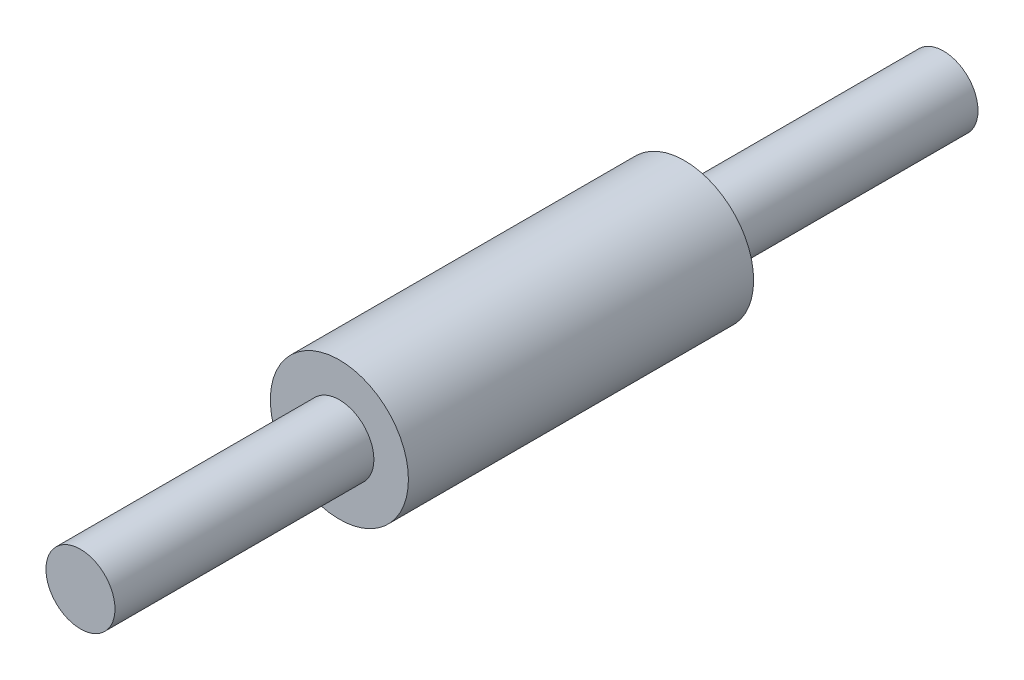
ISO-10303-21;
HEADER;
FILE_DESCRIPTION(('STEP AP214'),'2;1');
FILE_NAME('part.step','',(''),(''),'','','');
FILE_SCHEMA(('AUTOMOTIVE_DESIGN { 1 0 10303 214 1 1 1 1 }'));
ENDSEC;
DATA;
#1=APPLICATION_CONTEXT('core data for automotive mechanical design processes');
#2=APPLICATION_PROTOCOL_DEFINITION('international standard','automotive_design',2000,#1);
#3=PRODUCT_CONTEXT('',#1,'mechanical');
#4=PRODUCT('Part','Part','',(#3));
#5=PRODUCT_RELATED_PRODUCT_CATEGORY('part','',(#4));
#6=PRODUCT_DEFINITION_FORMATION('','',#4);
#7=PRODUCT_DEFINITION_CONTEXT('part definition',#1,'design');
#8=PRODUCT_DEFINITION('design','',#6,#7);
#9=PRODUCT_DEFINITION_SHAPE('','',#8);
#10=(LENGTH_UNIT() NAMED_UNIT(*) SI_UNIT(.MILLI.,.METRE.));
#11=(NAMED_UNIT(*) PLANE_ANGLE_UNIT() SI_UNIT($,.RADIAN.));
#12=(NAMED_UNIT(*) SI_UNIT($,.STERADIAN.) SOLID_ANGLE_UNIT());
#13=UNCERTAINTY_MEASURE_WITH_UNIT(LENGTH_MEASURE(1.E-05),#10,'distance_accuracy_value','');
#14=(GEOMETRIC_REPRESENTATION_CONTEXT(3) GLOBAL_UNCERTAINTY_ASSIGNED_CONTEXT((#13)) GLOBAL_UNIT_ASSIGNED_CONTEXT((#10,
#11,#12)) REPRESENTATION_CONTEXT('',''));
#15=CARTESIAN_POINT('',(0.,0.,0.));
#16=DIRECTION('',(0.,0.,1.));
#17=DIRECTION('',(1.,0.,0.));
#18=AXIS2_PLACEMENT_3D('',#15,#16,#17);
#19=CARTESIAN_POINT('',(0.,0.,-125.));
#20=DIRECTION('',(0.,0.,1.));
#21=DIRECTION('',(1.,0.,0.));
#22=AXIS2_PLACEMENT_3D('',#19,#20,#21);
#23=PLANE('',#22);
#24=CARTESIAN_POINT('',(0.,0.,-125.));
#25=DIRECTION('',(0.,0.,1.));
#26=DIRECTION('',(1.,0.,0.));
#27=AXIS2_PLACEMENT_3D('',#24,#25,#26);
#28=CIRCLE('',#27,10.);
#29=CARTESIAN_POINT('',(10.,0.,-125.));
#30=VERTEX_POINT('',#29);
#31=EDGE_CURVE('E10',#30,#30,#28,.T.);
#32=ORIENTED_EDGE('',*,*,#31,.F.);
#33=EDGE_LOOP('',(#32));
#34=FACE_BOUND('',#33,.T.);
#35=ADVANCED_FACE('F37',(#34),#23,.F.);
#36=CARTESIAN_POINT('',(0.,0.,125.));
#37=DIRECTION('',(0.,0.,1.));
#38=DIRECTION('',(1.,0.,0.));
#39=AXIS2_PLACEMENT_3D('',#36,#37,#38);
#40=CYLINDRICAL_SURFACE('',#39,9.99999999999999);
#41=CARTESIAN_POINT('',(0.,0.,-50.));
#42=DIRECTION('',(0.,0.,1.));
#43=DIRECTION('',(1.,0.,0.));
#44=AXIS2_PLACEMENT_3D('',#41,#42,#43);
#45=CIRCLE('',#44,9.99999999999999);
#46=CARTESIAN_POINT('',(9.99999999999999,0.,-50.));
#47=VERTEX_POINT('',#46);
#48=EDGE_CURVE('E44',#47,#47,#45,.T.);
#49=ORIENTED_EDGE('',*,*,#48,.F.);
#50=EDGE_LOOP('',(#49));
#51=FACE_BOUND('',#50,.T.);
#52=ORIENTED_EDGE('',*,*,#31,.T.);
#53=EDGE_LOOP('',(#52));
#54=FACE_BOUND('',#53,.T.);
#55=ADVANCED_FACE('F91',(#51,#54),#40,.T.);
#56=CARTESIAN_POINT('',(-9.99999999999999,0.,-50.));
#57=DIRECTION('',(0.,0.,1.));
#58=DIRECTION('',(1.,0.,0.));
#59=AXIS2_PLACEMENT_3D('',#56,#57,#58);
#60=PLANE('',#59);
#61=CARTESIAN_POINT('',(0.,0.,-50.));
#62=DIRECTION('',(0.,0.,1.));
#63=DIRECTION('',(1.,0.,0.));
#64=AXIS2_PLACEMENT_3D('',#61,#62,#63);
#65=CIRCLE('',#64,20.);
#66=CARTESIAN_POINT('',(20.,0.,-50.));
#67=VERTEX_POINT('',#66);
#68=EDGE_CURVE('E49',#67,#67,#65,.T.);
#69=ORIENTED_EDGE('',*,*,#68,.F.);
#70=EDGE_LOOP('',(#69));
#71=FACE_BOUND('',#70,.T.);
#72=ORIENTED_EDGE('',*,*,#48,.T.);
#73=EDGE_LOOP('',(#72));
#74=FACE_BOUND('',#73,.T.);
#75=ADVANCED_FACE('F86',(#71,#74),#60,.F.);
#76=CARTESIAN_POINT('',(0.,0.,125.));
#77=DIRECTION('',(0.,0.,1.));
#78=DIRECTION('',(1.,0.,0.));
#79=AXIS2_PLACEMENT_3D('',#76,#77,#78);
#80=CYLINDRICAL_SURFACE('',#79,20.);
#81=CARTESIAN_POINT('',(0.,0.,50.));
#82=DIRECTION('',(0.,0.,1.));
#83=DIRECTION('',(1.,0.,0.));
#84=AXIS2_PLACEMENT_3D('',#81,#82,#83);
#85=CIRCLE('',#84,20.);
#86=CARTESIAN_POINT('',(20.,0.,50.));
#87=VERTEX_POINT('',#86);
#88=EDGE_CURVE('E54',#87,#87,#85,.T.);
#89=ORIENTED_EDGE('',*,*,#88,.F.);
#90=EDGE_LOOP('',(#89));
#91=FACE_BOUND('',#90,.T.);
#92=ORIENTED_EDGE('',*,*,#68,.T.);
#93=EDGE_LOOP('',(#92));
#94=FACE_BOUND('',#93,.T.);
#95=ADVANCED_FACE('F80',(#91,#94),#80,.T.);
#96=CARTESIAN_POINT('',(-20.,0.,50.));
#97=DIRECTION('',(0.,0.,-1.));
#98=DIRECTION('',(-1.,0.,0.));
#99=AXIS2_PLACEMENT_3D('',#96,#97,#98);
#100=PLANE('',#99);
#101=CARTESIAN_POINT('',(0.,0.,50.));
#102=DIRECTION('',(0.,0.,1.));
#103=DIRECTION('',(1.,0.,0.));
#104=AXIS2_PLACEMENT_3D('',#101,#102,#103);
#105=CIRCLE('',#104,9.99999999999998);
#106=CARTESIAN_POINT('',(9.99999999999998,0.,50.));
#107=VERTEX_POINT('',#106);
#108=EDGE_CURVE('E60',#107,#107,#105,.T.);
#109=ORIENTED_EDGE('',*,*,#108,.F.);
#110=EDGE_LOOP('',(#109));
#111=FACE_BOUND('',#110,.T.);
#112=ORIENTED_EDGE('',*,*,#88,.T.);
#113=EDGE_LOOP('',(#112));
#114=FACE_BOUND('',#113,.T.);
#115=ADVANCED_FACE('F74',(#111,#114),#100,.F.);
#116=CARTESIAN_POINT('',(0.,0.,125.));
#117=DIRECTION('',(0.,0.,1.));
#118=DIRECTION('',(1.,0.,0.));
#119=AXIS2_PLACEMENT_3D('',#116,#117,#118);
#120=CYLINDRICAL_SURFACE('',#119,9.99999999999997);
#121=CARTESIAN_POINT('',(0.,0.,125.));
#122=DIRECTION('',(0.,0.,1.));
#123=DIRECTION('',(1.,0.,0.));
#124=AXIS2_PLACEMENT_3D('',#121,#122,#123);
#125=CIRCLE('',#124,9.99999999999997);
#126=CARTESIAN_POINT('',(9.99999999999997,0.,125.));
#127=VERTEX_POINT('',#126);
#128=EDGE_CURVE('E64',#127,#127,#125,.T.);
#129=ORIENTED_EDGE('',*,*,#128,.F.);
#130=EDGE_LOOP('',(#129));
#131=FACE_BOUND('',#130,.T.);
#132=ORIENTED_EDGE('',*,*,#108,.T.);
#133=EDGE_LOOP('',(#132));
#134=FACE_BOUND('',#133,.T.);
#135=ADVANCED_FACE('F71',(#131,#134),#120,.T.);
#136=CARTESIAN_POINT('',(-9.99999999999997,0.,125.));
#137=DIRECTION('',(0.,0.,-1.));
#138=DIRECTION('',(-1.,0.,0.));
#139=AXIS2_PLACEMENT_3D('',#136,#137,#138);
#140=PLANE('',#139);
#141=ORIENTED_EDGE('',*,*,#128,.T.);
#142=EDGE_LOOP('',(#141));
#143=FACE_BOUND('',#142,.T.);
#144=ADVANCED_FACE('F69',(#143),#140,.F.);
#145=CLOSED_SHELL('',(#35,#55,#75,#95,#115,#135,#144));
#146=MANIFOLD_SOLID_BREP('B2',#145);
#147=ADVANCED_BREP_SHAPE_REPRESENTATION('',(#18,#146),#14);
#148=SHAPE_DEFINITION_REPRESENTATION(#9,#147);
ENDSEC;
END-ISO-10303-21;
